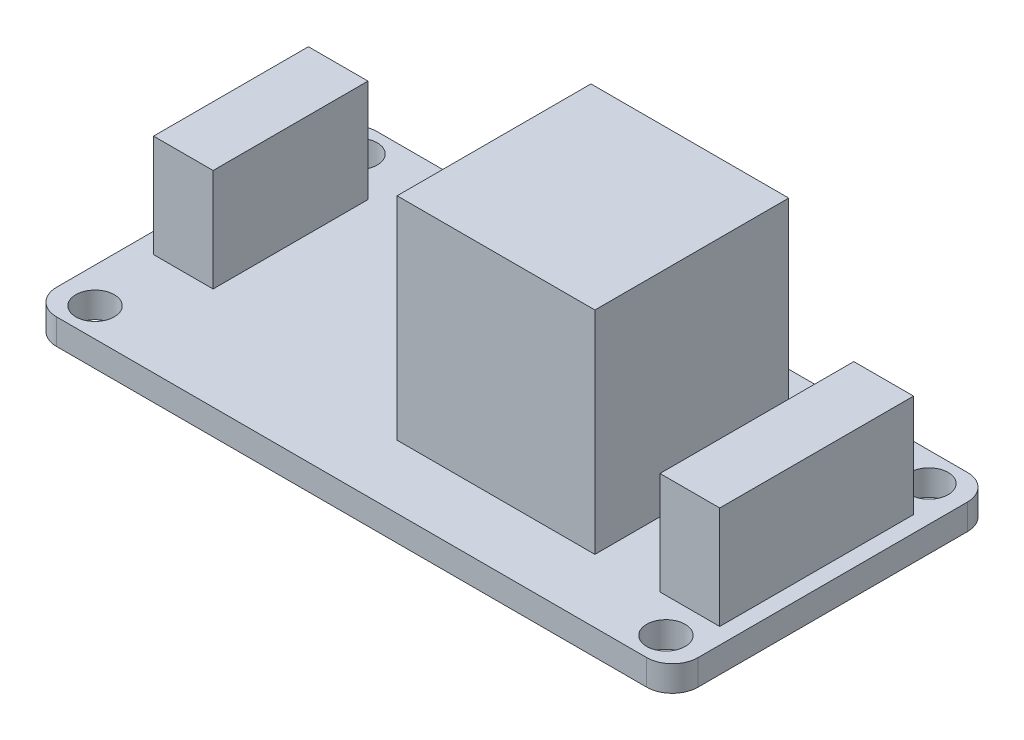
ISO-10303-21;
HEADER;
FILE_DESCRIPTION(('STEP AP214'),'2;1');
FILE_NAME('part.step','',(''),(''),'','','');
FILE_SCHEMA(('AUTOMOTIVE_DESIGN { 1 0 10303 214 1 1 1 1 }'));
ENDSEC;
DATA;
#1=APPLICATION_CONTEXT('core data for automotive mechanical design processes');
#2=APPLICATION_PROTOCOL_DEFINITION('international standard','automotive_design',2000,#1);
#3=PRODUCT_CONTEXT('',#1,'mechanical');
#4=PRODUCT('Part','Part','',(#3));
#5=PRODUCT_RELATED_PRODUCT_CATEGORY('part','',(#4));
#6=PRODUCT_DEFINITION_FORMATION('','',#4);
#7=PRODUCT_DEFINITION_CONTEXT('part definition',#1,'design');
#8=PRODUCT_DEFINITION('design','',#6,#7);
#9=PRODUCT_DEFINITION_SHAPE('','',#8);
#10=(LENGTH_UNIT() NAMED_UNIT(*) SI_UNIT(.MILLI.,.METRE.));
#11=(NAMED_UNIT(*) PLANE_ANGLE_UNIT() SI_UNIT($,.RADIAN.));
#12=(NAMED_UNIT(*) SI_UNIT($,.STERADIAN.) SOLID_ANGLE_UNIT());
#13=UNCERTAINTY_MEASURE_WITH_UNIT(LENGTH_MEASURE(1.E-05),#10,'distance_accuracy_value','');
#14=(GEOMETRIC_REPRESENTATION_CONTEXT(3) GLOBAL_UNCERTAINTY_ASSIGNED_CONTEXT((#13)) GLOBAL_UNIT_ASSIGNED_CONTEXT((#10,
#11,#12)) REPRESENTATION_CONTEXT('',''));
#15=CARTESIAN_POINT('',(0.,0.,0.));
#16=DIRECTION('',(0.,0.,1.));
#17=DIRECTION('',(1.,0.,0.));
#18=AXIS2_PLACEMENT_3D('',#15,#16,#17);
#19=CARTESIAN_POINT('',(0.,2.,0.));
#20=DIRECTION('',(0.,-1.,0.));
#21=DIRECTION('',(0.,0.,-1.));
#22=AXIS2_PLACEMENT_3D('',#19,#20,#21);
#23=PLANE('',#22);
#24=CARTESIAN_POINT('',(-22.25,2.,10.25));
#25=DIRECTION('',(0.,1.,0.));
#26=DIRECTION('',(0.,0.,-1.));
#27=AXIS2_PLACEMENT_3D('',#24,#25,#26);
#28=CIRCLE('',#27,1.5);
#29=CARTESIAN_POINT('',(-22.25,2.,8.75));
#30=VERTEX_POINT('',#29);
#31=EDGE_CURVE('E660',#30,#30,#28,.T.);
#32=ORIENTED_EDGE('',*,*,#31,.F.);
#33=EDGE_LOOP('',(#32));
#34=FACE_BOUND('',#33,.T.);
#35=CARTESIAN_POINT('',(22.25,2.,10.25));
#36=DIRECTION('',(0.,1.,0.));
#37=DIRECTION('',(0.,0.,1.));
#38=AXIS2_PLACEMENT_3D('',#35,#36,#37);
#39=CIRCLE('',#38,1.5);
#40=CARTESIAN_POINT('',(22.25,2.,11.75));
#41=VERTEX_POINT('',#40);
#42=EDGE_CURVE('E666',#41,#41,#39,.T.);
#43=ORIENTED_EDGE('',*,*,#42,.F.);
#44=EDGE_LOOP('',(#43));
#45=FACE_BOUND('',#44,.T.);
#46=CARTESIAN_POINT('',(22.25,2.,-10.25));
#47=DIRECTION('',(0.,1.,0.));
#48=DIRECTION('',(0.,0.,-1.));
#49=AXIS2_PLACEMENT_3D('',#46,#47,#48);
#50=CIRCLE('',#49,1.5);
#51=CARTESIAN_POINT('',(22.25,2.,-11.75));
#52=VERTEX_POINT('',#51);
#53=EDGE_CURVE('E672',#52,#52,#50,.T.);
#54=ORIENTED_EDGE('',*,*,#53,.F.);
#55=EDGE_LOOP('',(#54));
#56=FACE_BOUND('',#55,.T.);
#57=CARTESIAN_POINT('',(-22.25,2.,-10.25));
#58=DIRECTION('',(0.,1.,0.));
#59=DIRECTION('',(0.,0.,1.));
#60=AXIS2_PLACEMENT_3D('',#57,#58,#59);
#61=CIRCLE('',#60,1.5);
#62=CARTESIAN_POINT('',(-22.25,2.,-8.75));
#63=VERTEX_POINT('',#62);
#64=EDGE_CURVE('E652',#63,#63,#61,.T.);
#65=ORIENTED_EDGE('',*,*,#64,.F.);
#66=EDGE_LOOP('',(#65));
#67=FACE_BOUND('',#66,.T.);
#68=DIRECTION('',(1.,0.,0.));
#69=VECTOR('',#68,1.);
#70=CARTESIAN_POINT('',(0.,2.,4.51722782776187));
#71=LINE('',#70,#69);
#72=CARTESIAN_POINT('',(-23.4226143195784,2.,4.51722782776187));
#73=VERTEX_POINT('',#72);
#74=CARTESIAN_POINT('',(-18.7798477604559,2.,4.51722782776187));
#75=VERTEX_POINT('',#74);
#76=EDGE_CURVE('E199',#73,#75,#71,.T.);
#77=ORIENTED_EDGE('',*,*,#76,.F.);
#78=DIRECTION('',(0.,0.,-1.));
#79=VECTOR('',#78,1.);
#80=CARTESIAN_POINT('',(-23.4226143195784,2.,0.));
#81=LINE('',#80,#79);
#82=CARTESIAN_POINT('',(-23.4226143195784,2.,-7.55368079003915));
#83=VERTEX_POINT('',#82);
#84=EDGE_CURVE('E212',#73,#83,#81,.T.);
#85=ORIENTED_EDGE('',*,*,#84,.T.);
#86=DIRECTION('',(1.,0.,0.));
#87=VECTOR('',#86,1.);
#88=CARTESIAN_POINT('',(0.,2.,-7.55368079003915));
#89=LINE('',#88,#87);
#90=CARTESIAN_POINT('',(-18.7798477604559,2.,-7.55368079003915));
#91=VERTEX_POINT('',#90);
#92=EDGE_CURVE('E223',#83,#91,#89,.T.);
#93=ORIENTED_EDGE('',*,*,#92,.T.);
#94=DIRECTION('',(0.,0.,-1.));
#95=VECTOR('',#94,1.);
#96=CARTESIAN_POINT('',(-18.7798477604559,2.,0.));
#97=LINE('',#96,#95);
#98=EDGE_CURVE('E202',#75,#91,#97,.T.);
#99=ORIENTED_EDGE('',*,*,#98,.F.);
#100=EDGE_LOOP('',(#77,#85,#93,#99));
#101=FACE_BOUND('',#100,.T.);
#102=DIRECTION('',(0.,0.,-1.));
#103=VECTOR('',#102,1.);
#104=CARTESIAN_POINT('',(-1.40049791898988,2.,7.55368079003915));
#105=LINE('',#104,#103);
#106=CARTESIAN_POINT('',(-1.40049791898988,2.,7.55368079003915));
#107=VERTEX_POINT('',#106);
#108=CARTESIAN_POINT('',(-1.40049791898988,2.,-7.55368079003915));
#109=VERTEX_POINT('',#108);
#110=EDGE_CURVE('E241',#107,#109,#105,.T.);
#111=ORIENTED_EDGE('',*,*,#110,.T.);
#112=DIRECTION('',(1.,0.,0.));
#113=VECTOR('',#112,1.);
#114=CARTESIAN_POINT('',(-1.40049791898988,2.,-7.55368079003915));
#115=LINE('',#114,#113);
#116=CARTESIAN_POINT('',(14.0160765938653,2.,-7.55368079003915));
#117=VERTEX_POINT('',#116);
#118=EDGE_CURVE('E236',#109,#117,#115,.T.);
#119=ORIENTED_EDGE('',*,*,#118,.T.);
#120=DIRECTION('',(0.,0.,-1.));
#121=VECTOR('',#120,1.);
#122=CARTESIAN_POINT('',(14.0160765938653,2.,7.55368079003915));
#123=LINE('',#122,#121);
#124=CARTESIAN_POINT('',(14.0160765938653,2.,7.55368079003915));
#125=VERTEX_POINT('',#124);
#126=EDGE_CURVE('E251',#125,#117,#123,.T.);
#127=ORIENTED_EDGE('',*,*,#126,.F.);
#128=DIRECTION('',(1.,0.,0.));
#129=VECTOR('',#128,1.);
#130=CARTESIAN_POINT('',(-1.40049791898988,2.,7.55368079003915));
#131=LINE('',#130,#129);
#132=EDGE_CURVE('E254',#107,#125,#131,.T.);
#133=ORIENTED_EDGE('',*,*,#132,.F.);
#134=EDGE_LOOP('',(#111,#119,#127,#133));
#135=FACE_BOUND('',#134,.T.);
#136=DIRECTION('',(0.,0.,-1.));
#137=VECTOR('',#136,1.);
#138=CARTESIAN_POINT('',(25.,2.,12.5));
#139=LINE('',#138,#137);
#140=CARTESIAN_POINT('',(25.,2.,10.5));
#141=VERTEX_POINT('',#140);
#142=CARTESIAN_POINT('',(25.,2.,-10.5));
#143=VERTEX_POINT('',#142);
#144=EDGE_CURVE('E268',#141,#143,#139,.T.);
#145=ORIENTED_EDGE('',*,*,#144,.T.);
#146=CARTESIAN_POINT('',(23.,2.,-10.5));
#147=DIRECTION('',(0.,-1.,0.));
#148=DIRECTION('',(0.,0.,-1.));
#149=AXIS2_PLACEMENT_3D('',#146,#147,#148);
#150=CIRCLE('',#149,2.);
#151=CARTESIAN_POINT('',(23.,2.,-12.5));
#152=VERTEX_POINT('',#151);
#153=EDGE_CURVE('E311',#143,#152,#150,.F.);
#154=ORIENTED_EDGE('',*,*,#153,.T.);
#155=DIRECTION('',(-1.,0.,0.));
#156=VECTOR('',#155,1.);
#157=CARTESIAN_POINT('',(-25.,2.,-12.5));
#158=LINE('',#157,#156);
#159=CARTESIAN_POINT('',(-23.,2.,-12.5));
#160=VERTEX_POINT('',#159);
#161=EDGE_CURVE('E271',#152,#160,#158,.T.);
#162=ORIENTED_EDGE('',*,*,#161,.T.);
#163=CARTESIAN_POINT('',(-23.,2.,-10.5));
#164=DIRECTION('',(0.,-1.,0.));
#165=DIRECTION('',(0.,0.,-1.));
#166=AXIS2_PLACEMENT_3D('',#163,#164,#165);
#167=CIRCLE('',#166,2.);
#168=CARTESIAN_POINT('',(-25.,2.,-10.5));
#169=VERTEX_POINT('',#168);
#170=EDGE_CURVE('E306',#160,#169,#167,.F.);
#171=ORIENTED_EDGE('',*,*,#170,.T.);
#172=DIRECTION('',(0.,0.,1.));
#173=VECTOR('',#172,1.);
#174=CARTESIAN_POINT('',(-25.,2.,12.5));
#175=LINE('',#174,#173);
#176=CARTESIAN_POINT('',(-25.,2.,10.5));
#177=VERTEX_POINT('',#176);
#178=EDGE_CURVE('E275',#169,#177,#175,.T.);
#179=ORIENTED_EDGE('',*,*,#178,.T.);
#180=CARTESIAN_POINT('',(-23.,2.,10.5));
#181=DIRECTION('',(0.,-1.,0.));
#182=DIRECTION('',(0.,0.,-1.));
#183=AXIS2_PLACEMENT_3D('',#180,#181,#182);
#184=CIRCLE('',#183,2.);
#185=CARTESIAN_POINT('',(-23.,2.,12.5));
#186=VERTEX_POINT('',#185);
#187=EDGE_CURVE('E58',#177,#186,#184,.F.);
#188=ORIENTED_EDGE('',*,*,#187,.T.);
#189=DIRECTION('',(1.,0.,0.));
#190=VECTOR('',#189,1.);
#191=CARTESIAN_POINT('',(-25.,2.,12.5));
#192=LINE('',#191,#190);
#193=CARTESIAN_POINT('',(23.,2.,12.5));
#194=VERTEX_POINT('',#193);
#195=EDGE_CURVE('E277',#186,#194,#192,.T.);
#196=ORIENTED_EDGE('',*,*,#195,.T.);
#197=CARTESIAN_POINT('',(23.,2.,10.5));
#198=DIRECTION('',(0.,-1.,0.));
#199=DIRECTION('',(0.,0.,-1.));
#200=AXIS2_PLACEMENT_3D('',#197,#198,#199);
#201=CIRCLE('',#200,2.);
#202=EDGE_CURVE('E309',#194,#141,#201,.F.);
#203=ORIENTED_EDGE('',*,*,#202,.T.);
#204=EDGE_LOOP('',(#145,#154,#162,#171,#179,#188,#196,#203));
#205=FACE_BOUND('',#204,.T.);
#206=DIRECTION('',(1.,0.,0.));
#207=VECTOR('',#206,1.);
#208=CARTESIAN_POINT('',(0.,2.,7.55368079003915));
#209=LINE('',#208,#207);
#210=CARTESIAN_POINT('',(19.0897135690898,2.,7.55368079003915));
#211=VERTEX_POINT('',#210);
#212=CARTESIAN_POINT('',(23.7467902038446,2.,7.55368079003915));
#213=VERTEX_POINT('',#212);
#214=EDGE_CURVE('E197',#211,#213,#209,.T.);
#215=ORIENTED_EDGE('',*,*,#214,.F.);
#216=DIRECTION('',(0.,0.,-1.));
#217=VECTOR('',#216,1.);
#218=CARTESIAN_POINT('',(19.0897135690898,2.,0.));
#219=LINE('',#218,#217);
#220=CARTESIAN_POINT('',(19.0897135690898,2.,-7.55368079003915));
#221=VERTEX_POINT('',#220);
#222=EDGE_CURVE('E193',#211,#221,#219,.T.);
#223=ORIENTED_EDGE('',*,*,#222,.T.);
#224=DIRECTION('',(1.,0.,0.));
#225=VECTOR('',#224,1.);
#226=CARTESIAN_POINT('',(0.,2.,-7.55368079003915));
#227=LINE('',#226,#225);
#228=CARTESIAN_POINT('',(23.7467902038446,2.,-7.55368079003915));
#229=VERTEX_POINT('',#228);
#230=EDGE_CURVE('E637',#221,#229,#227,.T.);
#231=ORIENTED_EDGE('',*,*,#230,.T.);
#232=DIRECTION('',(0.,0.,-1.));
#233=VECTOR('',#232,1.);
#234=CARTESIAN_POINT('',(23.7467902038446,2.,0.));
#235=LINE('',#234,#233);
#236=EDGE_CURVE('E640',#213,#229,#235,.T.);
#237=ORIENTED_EDGE('',*,*,#236,.F.);
#238=EDGE_LOOP('',(#215,#223,#231,#237));
#239=FACE_BOUND('',#238,.T.);
#240=ADVANCED_FACE('F36',(#34,#45,#56,#67,#101,#135,#205,#239),#23,.F.);
#241=CARTESIAN_POINT('',(25.,2.,12.5));
#242=DIRECTION('',(-1.,0.,0.));
#243=DIRECTION('',(0.,0.,1.));
#244=AXIS2_PLACEMENT_3D('',#241,#242,#243);
#245=PLANE('',#244);
#246=DIRECTION('',(0.,0.,-1.));
#247=VECTOR('',#246,1.);
#248=CARTESIAN_POINT('',(25.,0.,12.5));
#249=LINE('',#248,#247);
#250=CARTESIAN_POINT('',(25.,0.,10.5));
#251=VERTEX_POINT('',#250);
#252=CARTESIAN_POINT('',(25.,0.,-10.5));
#253=VERTEX_POINT('',#252);
#254=EDGE_CURVE('E261',#251,#253,#249,.T.);
#255=ORIENTED_EDGE('',*,*,#254,.T.);
#256=DIRECTION('',(0.,-1.,0.));
#257=VECTOR('',#256,1.);
#258=CARTESIAN_POINT('',(25.,2.,-10.5));
#259=LINE('',#258,#257);
#260=EDGE_CURVE('E304',#253,#143,#259,.F.);
#261=ORIENTED_EDGE('',*,*,#260,.T.);
#262=ORIENTED_EDGE('',*,*,#144,.F.);
#263=DIRECTION('',(0.,-1.,0.));
#264=VECTOR('',#263,1.);
#265=CARTESIAN_POINT('',(25.,2.,10.5));
#266=LINE('',#265,#264);
#267=EDGE_CURVE('E301',#141,#251,#266,.T.);
#268=ORIENTED_EDGE('',*,*,#267,.T.);
#269=EDGE_LOOP('',(#255,#261,#262,#268));
#270=FACE_BOUND('',#269,.T.);
#271=ADVANCED_FACE('F341',(#270),#245,.F.);
#272=CARTESIAN_POINT('',(-25.,2.,-12.5));
#273=DIRECTION('',(0.,0.,1.));
#274=DIRECTION('',(1.,0.,0.));
#275=AXIS2_PLACEMENT_3D('',#272,#273,#274);
#276=PLANE('',#275);
#277=ORIENTED_EDGE('',*,*,#161,.F.);
#278=DIRECTION('',(0.,-1.,0.));
#279=VECTOR('',#278,1.);
#280=CARTESIAN_POINT('',(23.,2.,-12.5));
#281=LINE('',#280,#279);
#282=CARTESIAN_POINT('',(23.,0.,-12.5));
#283=VERTEX_POINT('',#282);
#284=EDGE_CURVE('E290',#152,#283,#281,.T.);
#285=ORIENTED_EDGE('',*,*,#284,.T.);
#286=DIRECTION('',(-1.,0.,0.));
#287=VECTOR('',#286,1.);
#288=CARTESIAN_POINT('',(-25.,0.,-12.5));
#289=LINE('',#288,#287);
#290=CARTESIAN_POINT('',(-23.,0.,-12.5));
#291=VERTEX_POINT('',#290);
#292=EDGE_CURVE('E282',#283,#291,#289,.T.);
#293=ORIENTED_EDGE('',*,*,#292,.T.);
#294=DIRECTION('',(0.,-1.,0.));
#295=VECTOR('',#294,1.);
#296=CARTESIAN_POINT('',(-23.,2.,-12.5));
#297=LINE('',#296,#295);
#298=EDGE_CURVE('E279',#291,#160,#297,.F.);
#299=ORIENTED_EDGE('',*,*,#298,.T.);
#300=EDGE_LOOP('',(#277,#285,#293,#299));
#301=FACE_BOUND('',#300,.T.);
#302=ADVANCED_FACE('F349',(#301),#276,.F.);
#303=CARTESIAN_POINT('',(-25.,2.,12.5));
#304=DIRECTION('',(1.,0.,0.));
#305=DIRECTION('',(0.,0.,-1.));
#306=AXIS2_PLACEMENT_3D('',#303,#304,#305);
#307=PLANE('',#306);
#308=DIRECTION('',(0.,0.,1.));
#309=VECTOR('',#308,1.);
#310=CARTESIAN_POINT('',(-25.,0.,12.5));
#311=LINE('',#310,#309);
#312=CARTESIAN_POINT('',(-25.,0.,-10.5));
#313=VERTEX_POINT('',#312);
#314=CARTESIAN_POINT('',(-25.,0.,10.5));
#315=VERTEX_POINT('',#314);
#316=EDGE_CURVE('E285',#313,#315,#311,.T.);
#317=ORIENTED_EDGE('',*,*,#316,.T.);
#318=DIRECTION('',(0.,-1.,0.));
#319=VECTOR('',#318,1.);
#320=CARTESIAN_POINT('',(-25.,2.,10.5));
#321=LINE('',#320,#319);
#322=EDGE_CURVE('E11',#315,#177,#321,.F.);
#323=ORIENTED_EDGE('',*,*,#322,.T.);
#324=ORIENTED_EDGE('',*,*,#178,.F.);
#325=DIRECTION('',(0.,-1.,0.));
#326=VECTOR('',#325,1.);
#327=CARTESIAN_POINT('',(-25.,2.,-10.5));
#328=LINE('',#327,#326);
#329=EDGE_CURVE('E44',#169,#313,#328,.T.);
#330=ORIENTED_EDGE('',*,*,#329,.T.);
#331=EDGE_LOOP('',(#317,#323,#324,#330));
#332=FACE_BOUND('',#331,.T.);
#333=ADVANCED_FACE('F321',(#332),#307,.F.);
#334=CARTESIAN_POINT('',(-25.,2.,12.5));
#335=DIRECTION('',(0.,0.,-1.));
#336=DIRECTION('',(-1.,0.,0.));
#337=AXIS2_PLACEMENT_3D('',#334,#335,#336);
#338=PLANE('',#337);
#339=DIRECTION('',(1.,0.,0.));
#340=VECTOR('',#339,1.);
#341=CARTESIAN_POINT('',(-25.,0.,12.5));
#342=LINE('',#341,#340);
#343=CARTESIAN_POINT('',(-23.,0.,12.5));
#344=VERTEX_POINT('',#343);
#345=CARTESIAN_POINT('',(23.,0.,12.5));
#346=VERTEX_POINT('',#345);
#347=EDGE_CURVE('E272',#344,#346,#342,.T.);
#348=ORIENTED_EDGE('',*,*,#347,.T.);
#349=DIRECTION('',(0.,-1.,0.));
#350=VECTOR('',#349,1.);
#351=CARTESIAN_POINT('',(23.,2.,12.5));
#352=LINE('',#351,#350);
#353=EDGE_CURVE('E51',#346,#194,#352,.F.);
#354=ORIENTED_EDGE('',*,*,#353,.T.);
#355=ORIENTED_EDGE('',*,*,#195,.F.);
#356=DIRECTION('',(0.,-1.,0.));
#357=VECTOR('',#356,1.);
#358=CARTESIAN_POINT('',(-23.,2.,12.5));
#359=LINE('',#358,#357);
#360=EDGE_CURVE('E313',#186,#344,#359,.T.);
#361=ORIENTED_EDGE('',*,*,#360,.T.);
#362=EDGE_LOOP('',(#348,#354,#355,#361));
#363=FACE_BOUND('',#362,.T.);
#364=ADVANCED_FACE('F332',(#363),#338,.F.);
#365=CARTESIAN_POINT('',(0.,0.,0.));
#366=DIRECTION('',(0.,-1.,0.));
#367=DIRECTION('',(0.,0.,-1.));
#368=AXIS2_PLACEMENT_3D('',#365,#366,#367);
#369=PLANE('',#368);
#370=CARTESIAN_POINT('',(-22.25,0.,10.25));
#371=DIRECTION('',(0.,1.,0.));
#372=DIRECTION('',(0.,0.,-1.));
#373=AXIS2_PLACEMENT_3D('',#370,#371,#372);
#374=CIRCLE('',#373,1.5);
#375=CARTESIAN_POINT('',(-22.25,0.,8.75));
#376=VERTEX_POINT('',#375);
#377=EDGE_CURVE('E663',#376,#376,#374,.T.);
#378=ORIENTED_EDGE('',*,*,#377,.T.);
#379=EDGE_LOOP('',(#378));
#380=FACE_BOUND('',#379,.T.);
#381=CARTESIAN_POINT('',(22.25,0.,10.25));
#382=DIRECTION('',(0.,1.,0.));
#383=DIRECTION('',(0.,0.,1.));
#384=AXIS2_PLACEMENT_3D('',#381,#382,#383);
#385=CIRCLE('',#384,1.5);
#386=CARTESIAN_POINT('',(22.25,0.,11.75));
#387=VERTEX_POINT('',#386);
#388=EDGE_CURVE('E669',#387,#387,#385,.T.);
#389=ORIENTED_EDGE('',*,*,#388,.T.);
#390=EDGE_LOOP('',(#389));
#391=FACE_BOUND('',#390,.T.);
#392=CARTESIAN_POINT('',(22.25,0.,-10.25));
#393=DIRECTION('',(0.,1.,0.));
#394=DIRECTION('',(0.,0.,-1.));
#395=AXIS2_PLACEMENT_3D('',#392,#393,#394);
#396=CIRCLE('',#395,1.5);
#397=CARTESIAN_POINT('',(22.25,0.,-11.75));
#398=VERTEX_POINT('',#397);
#399=EDGE_CURVE('E657',#398,#398,#396,.T.);
#400=ORIENTED_EDGE('',*,*,#399,.T.);
#401=EDGE_LOOP('',(#400));
#402=FACE_BOUND('',#401,.T.);
#403=CARTESIAN_POINT('',(-22.25,0.,-10.25));
#404=DIRECTION('',(0.,1.,0.));
#405=DIRECTION('',(0.,0.,1.));
#406=AXIS2_PLACEMENT_3D('',#403,#404,#405);
#407=CIRCLE('',#406,1.5);
#408=CARTESIAN_POINT('',(-22.25,0.,-8.75));
#409=VERTEX_POINT('',#408);
#410=EDGE_CURVE('E650',#409,#409,#407,.T.);
#411=ORIENTED_EDGE('',*,*,#410,.T.);
#412=EDGE_LOOP('',(#411));
#413=FACE_BOUND('',#412,.T.);
#414=ORIENTED_EDGE('',*,*,#292,.F.);
#415=CARTESIAN_POINT('',(23.,0.,-10.5));
#416=DIRECTION('',(0.,-1.,0.));
#417=DIRECTION('',(0.,0.,-1.));
#418=AXIS2_PLACEMENT_3D('',#415,#416,#417);
#419=CIRCLE('',#418,2.);
#420=EDGE_CURVE('E299',#283,#253,#419,.T.);
#421=ORIENTED_EDGE('',*,*,#420,.T.);
#422=ORIENTED_EDGE('',*,*,#254,.F.);
#423=CARTESIAN_POINT('',(23.,0.,10.5));
#424=DIRECTION('',(0.,-1.,0.));
#425=DIRECTION('',(0.,0.,-1.));
#426=AXIS2_PLACEMENT_3D('',#423,#424,#425);
#427=CIRCLE('',#426,2.);
#428=EDGE_CURVE('E297',#251,#346,#427,.T.);
#429=ORIENTED_EDGE('',*,*,#428,.T.);
#430=ORIENTED_EDGE('',*,*,#347,.F.);
#431=CARTESIAN_POINT('',(-23.,0.,10.5));
#432=DIRECTION('',(0.,-1.,0.));
#433=DIRECTION('',(0.,0.,-1.));
#434=AXIS2_PLACEMENT_3D('',#431,#432,#433);
#435=CIRCLE('',#434,2.);
#436=EDGE_CURVE('E295',#344,#315,#435,.T.);
#437=ORIENTED_EDGE('',*,*,#436,.T.);
#438=ORIENTED_EDGE('',*,*,#316,.F.);
#439=CARTESIAN_POINT('',(-23.,0.,-10.5));
#440=DIRECTION('',(0.,-1.,0.));
#441=DIRECTION('',(0.,0.,-1.));
#442=AXIS2_PLACEMENT_3D('',#439,#440,#441);
#443=CIRCLE('',#442,2.);
#444=EDGE_CURVE('E293',#313,#291,#443,.T.);
#445=ORIENTED_EDGE('',*,*,#444,.T.);
#446=EDGE_LOOP('',(#414,#421,#422,#429,#430,#437,#438,#445));
#447=FACE_BOUND('',#446,.T.);
#448=ADVANCED_FACE('F327',(#380,#391,#402,#413,#447),#369,.T.);
#449=CARTESIAN_POINT('',(-1.40049791898988,18.5,-7.55368079003915));
#450=DIRECTION('',(0.,0.,-1.));
#451=DIRECTION('',(-1.,0.,0.));
#452=AXIS2_PLACEMENT_3D('',#449,#450,#451);
#453=PLANE('',#452);
#454=ORIENTED_EDGE('',*,*,#118,.F.);
#455=DIRECTION('',(0.,-1.,0.));
#456=VECTOR('',#455,1.);
#457=CARTESIAN_POINT('',(-1.40049791898988,18.5,-7.55368079003915));
#458=LINE('',#457,#456);
#459=CARTESIAN_POINT('',(-1.40049791898988,18.5,-7.55368079003915));
#460=VERTEX_POINT('',#459);
#461=EDGE_CURVE('E258',#460,#109,#458,.T.);
#462=ORIENTED_EDGE('',*,*,#461,.F.);
#463=DIRECTION('',(1.,0.,0.));
#464=VECTOR('',#463,1.);
#465=CARTESIAN_POINT('',(-1.40049791898988,18.5,-7.55368079003915));
#466=LINE('',#465,#464);
#467=CARTESIAN_POINT('',(14.0160765938653,18.5,-7.55368079003915));
#468=VERTEX_POINT('',#467);
#469=EDGE_CURVE('E237',#460,#468,#466,.T.);
#470=ORIENTED_EDGE('',*,*,#469,.T.);
#471=DIRECTION('',(0.,-1.,0.));
#472=VECTOR('',#471,1.);
#473=CARTESIAN_POINT('',(14.0160765938653,18.5,-7.55368079003915));
#474=LINE('',#473,#472);
#475=EDGE_CURVE('E248',#468,#117,#474,.T.);
#476=ORIENTED_EDGE('',*,*,#475,.T.);
#477=EDGE_LOOP('',(#454,#462,#470,#476));
#478=FACE_BOUND('',#477,.T.);
#479=ADVANCED_FACE('F367',(#478),#453,.T.);
#480=CARTESIAN_POINT('',(-1.40049791898988,18.5,7.55368079003915));
#481=DIRECTION('',(-1.,0.,0.));
#482=DIRECTION('',(0.,0.,1.));
#483=AXIS2_PLACEMENT_3D('',#480,#481,#482);
#484=PLANE('',#483);
#485=ORIENTED_EDGE('',*,*,#110,.F.);
#486=DIRECTION('',(0.,-1.,0.));
#487=VECTOR('',#486,1.);
#488=CARTESIAN_POINT('',(-1.40049791898988,18.5,7.55368079003915));
#489=LINE('',#488,#487);
#490=CARTESIAN_POINT('',(-1.40049791898988,18.5,7.55368079003915));
#491=VERTEX_POINT('',#490);
#492=EDGE_CURVE('E262',#491,#107,#489,.T.);
#493=ORIENTED_EDGE('',*,*,#492,.F.);
#494=DIRECTION('',(0.,0.,-1.));
#495=VECTOR('',#494,1.);
#496=CARTESIAN_POINT('',(-1.40049791898988,18.5,7.55368079003915));
#497=LINE('',#496,#495);
#498=EDGE_CURVE('E245',#491,#460,#497,.T.);
#499=ORIENTED_EDGE('',*,*,#498,.T.);
#500=ORIENTED_EDGE('',*,*,#461,.T.);
#501=EDGE_LOOP('',(#485,#493,#499,#500));
#502=FACE_BOUND('',#501,.T.);
#503=ADVANCED_FACE('F551',(#502),#484,.T.);
#504=CARTESIAN_POINT('',(-1.40049791898988,18.5,7.55368079003915));
#505=DIRECTION('',(0.,0.,-1.));
#506=DIRECTION('',(-1.,0.,0.));
#507=AXIS2_PLACEMENT_3D('',#504,#505,#506);
#508=PLANE('',#507);
#509=ORIENTED_EDGE('',*,*,#132,.T.);
#510=DIRECTION('',(0.,-1.,0.));
#511=VECTOR('',#510,1.);
#512=CARTESIAN_POINT('',(14.0160765938653,18.5,7.55368079003915));
#513=LINE('',#512,#511);
#514=CARTESIAN_POINT('',(14.0160765938653,18.5,7.55368079003915));
#515=VERTEX_POINT('',#514);
#516=EDGE_CURVE('E264',#515,#125,#513,.T.);
#517=ORIENTED_EDGE('',*,*,#516,.F.);
#518=DIRECTION('',(1.,0.,0.));
#519=VECTOR('',#518,1.);
#520=CARTESIAN_POINT('',(-1.40049791898988,18.5,7.55368079003915));
#521=LINE('',#520,#519);
#522=EDGE_CURVE('E243',#491,#515,#521,.T.);
#523=ORIENTED_EDGE('',*,*,#522,.F.);
#524=ORIENTED_EDGE('',*,*,#492,.T.);
#525=EDGE_LOOP('',(#509,#517,#523,#524));
#526=FACE_BOUND('',#525,.T.);
#527=ADVANCED_FACE('F543',(#526),#508,.F.);
#528=CARTESIAN_POINT('',(14.0160765938653,18.5,7.55368079003915));
#529=DIRECTION('',(-1.,0.,0.));
#530=DIRECTION('',(0.,0.,1.));
#531=AXIS2_PLACEMENT_3D('',#528,#529,#530);
#532=PLANE('',#531);
#533=ORIENTED_EDGE('',*,*,#126,.T.);
#534=ORIENTED_EDGE('',*,*,#475,.F.);
#535=DIRECTION('',(0.,0.,-1.));
#536=VECTOR('',#535,1.);
#537=CARTESIAN_POINT('',(14.0160765938653,18.5,7.55368079003915));
#538=LINE('',#537,#536);
#539=EDGE_CURVE('E240',#515,#468,#538,.T.);
#540=ORIENTED_EDGE('',*,*,#539,.F.);
#541=ORIENTED_EDGE('',*,*,#516,.T.);
#542=EDGE_LOOP('',(#533,#534,#540,#541));
#543=FACE_BOUND('',#542,.T.);
#544=ADVANCED_FACE('F534',(#543),#532,.F.);
#545=CARTESIAN_POINT('',(0.,18.5,0.));
#546=DIRECTION('',(0.,1.,0.));
#547=DIRECTION('',(0.,0.,1.));
#548=AXIS2_PLACEMENT_3D('',#545,#546,#547);
#549=PLANE('',#548);
#550=ORIENTED_EDGE('',*,*,#469,.F.);
#551=ORIENTED_EDGE('',*,*,#498,.F.);
#552=ORIENTED_EDGE('',*,*,#522,.T.);
#553=ORIENTED_EDGE('',*,*,#539,.T.);
#554=EDGE_LOOP('',(#550,#551,#552,#553));
#555=FACE_BOUND('',#554,.T.);
#556=ADVANCED_FACE('F520',(#555),#549,.T.);
#557=CARTESIAN_POINT('',(0.,10.,4.51722782776187));
#558=DIRECTION('',(0.,0.,-1.));
#559=DIRECTION('',(-1.,0.,0.));
#560=AXIS2_PLACEMENT_3D('',#557,#558,#559);
#561=PLANE('',#560);
#562=ORIENTED_EDGE('',*,*,#76,.T.);
#563=DIRECTION('',(0.,-1.,0.));
#564=VECTOR('',#563,1.);
#565=CARTESIAN_POINT('',(-18.7798477604559,10.,4.51722782776187));
#566=LINE('',#565,#564);
#567=CARTESIAN_POINT('',(-18.7798477604559,10.,4.51722782776187));
#568=VERTEX_POINT('',#567);
#569=EDGE_CURVE('E234',#568,#75,#566,.T.);
#570=ORIENTED_EDGE('',*,*,#569,.F.);
#571=DIRECTION('',(1.,0.,0.));
#572=VECTOR('',#571,1.);
#573=CARTESIAN_POINT('',(0.,10.,4.51722782776187));
#574=LINE('',#573,#572);
#575=CARTESIAN_POINT('',(-23.4226143195784,10.,4.51722782776187));
#576=VERTEX_POINT('',#575);
#577=EDGE_CURVE('E208',#576,#568,#574,.T.);
#578=ORIENTED_EDGE('',*,*,#577,.F.);
#579=DIRECTION('',(0.,-1.,0.));
#580=VECTOR('',#579,1.);
#581=CARTESIAN_POINT('',(-23.4226143195784,10.,4.51722782776187));
#582=LINE('',#581,#580);
#583=EDGE_CURVE('E219',#576,#73,#582,.T.);
#584=ORIENTED_EDGE('',*,*,#583,.T.);
#585=EDGE_LOOP('',(#562,#570,#578,#584));
#586=FACE_BOUND('',#585,.T.);
#587=ADVANCED_FACE('F511',(#586),#561,.F.);
#588=CARTESIAN_POINT('',(-18.7798477604559,10.,0.));
#589=DIRECTION('',(-1.,0.,0.));
#590=DIRECTION('',(0.,0.,1.));
#591=AXIS2_PLACEMENT_3D('',#588,#589,#590);
#592=PLANE('',#591);
#593=ORIENTED_EDGE('',*,*,#98,.T.);
#594=DIRECTION('',(0.,-1.,0.));
#595=VECTOR('',#594,1.);
#596=CARTESIAN_POINT('',(-18.7798477604559,10.,-7.55368079003915));
#597=LINE('',#596,#595);
#598=CARTESIAN_POINT('',(-18.7798477604559,10.,-7.55368079003915));
#599=VERTEX_POINT('',#598);
#600=EDGE_CURVE('E232',#599,#91,#597,.T.);
#601=ORIENTED_EDGE('',*,*,#600,.F.);
#602=DIRECTION('',(0.,0.,-1.));
#603=VECTOR('',#602,1.);
#604=CARTESIAN_POINT('',(-18.7798477604559,10.,0.));
#605=LINE('',#604,#603);
#606=EDGE_CURVE('E211',#568,#599,#605,.T.);
#607=ORIENTED_EDGE('',*,*,#606,.F.);
#608=ORIENTED_EDGE('',*,*,#569,.T.);
#609=EDGE_LOOP('',(#593,#601,#607,#608));
#610=FACE_BOUND('',#609,.T.);
#611=ADVANCED_FACE('F502',(#610),#592,.F.);
#612=CARTESIAN_POINT('',(0.,10.,-7.55368079003915));
#613=DIRECTION('',(0.,0.,-1.));
#614=DIRECTION('',(-1.,0.,0.));
#615=AXIS2_PLACEMENT_3D('',#612,#613,#614);
#616=PLANE('',#615);
#617=ORIENTED_EDGE('',*,*,#92,.F.);
#618=DIRECTION('',(0.,-1.,0.));
#619=VECTOR('',#618,1.);
#620=CARTESIAN_POINT('',(-23.4226143195784,10.,-7.55368079003915));
#621=LINE('',#620,#619);
#622=CARTESIAN_POINT('',(-23.4226143195784,10.,-7.55368079003915));
#623=VERTEX_POINT('',#622);
#624=EDGE_CURVE('E229',#623,#83,#621,.T.);
#625=ORIENTED_EDGE('',*,*,#624,.F.);
#626=DIRECTION('',(1.,0.,0.));
#627=VECTOR('',#626,1.);
#628=CARTESIAN_POINT('',(0.,10.,-7.55368079003915));
#629=LINE('',#628,#627);
#630=EDGE_CURVE('E214',#623,#599,#629,.T.);
#631=ORIENTED_EDGE('',*,*,#630,.T.);
#632=ORIENTED_EDGE('',*,*,#600,.T.);
#633=EDGE_LOOP('',(#617,#625,#631,#632));
#634=FACE_BOUND('',#633,.T.);
#635=ADVANCED_FACE('F493',(#634),#616,.T.);
#636=CARTESIAN_POINT('',(-23.4226143195784,10.,0.));
#637=DIRECTION('',(-1.,0.,0.));
#638=DIRECTION('',(0.,0.,1.));
#639=AXIS2_PLACEMENT_3D('',#636,#637,#638);
#640=PLANE('',#639);
#641=ORIENTED_EDGE('',*,*,#84,.F.);
#642=ORIENTED_EDGE('',*,*,#583,.F.);
#643=DIRECTION('',(0.,0.,-1.));
#644=VECTOR('',#643,1.);
#645=CARTESIAN_POINT('',(-23.4226143195784,10.,0.));
#646=LINE('',#645,#644);
#647=EDGE_CURVE('E217',#576,#623,#646,.T.);
#648=ORIENTED_EDGE('',*,*,#647,.T.);
#649=ORIENTED_EDGE('',*,*,#624,.T.);
#650=EDGE_LOOP('',(#641,#642,#648,#649));
#651=FACE_BOUND('',#650,.T.);
#652=ADVANCED_FACE('F484',(#651),#640,.T.);
#653=CARTESIAN_POINT('',(0.,10.,0.));
#654=DIRECTION('',(0.,1.,0.));
#655=DIRECTION('',(0.,0.,1.));
#656=AXIS2_PLACEMENT_3D('',#653,#654,#655);
#657=PLANE('',#656);
#658=ORIENTED_EDGE('',*,*,#577,.T.);
#659=ORIENTED_EDGE('',*,*,#606,.T.);
#660=ORIENTED_EDGE('',*,*,#630,.F.);
#661=ORIENTED_EDGE('',*,*,#647,.F.);
#662=EDGE_LOOP('',(#658,#659,#660,#661));
#663=FACE_BOUND('',#662,.T.);
#664=ADVANCED_FACE('F476',(#663),#657,.T.);
#665=CARTESIAN_POINT('',(0.,10.,7.55368079003915));
#666=DIRECTION('',(0.,0.,-1.));
#667=DIRECTION('',(-1.,0.,0.));
#668=AXIS2_PLACEMENT_3D('',#665,#666,#667);
#669=PLANE('',#668);
#670=ORIENTED_EDGE('',*,*,#214,.T.);
#671=DIRECTION('',(0.,-1.,0.));
#672=VECTOR('',#671,1.);
#673=CARTESIAN_POINT('',(23.7467902038446,10.,7.55368079003915));
#674=LINE('',#673,#672);
#675=CARTESIAN_POINT('',(23.7467902038446,10.,7.55368079003915));
#676=VERTEX_POINT('',#675);
#677=EDGE_CURVE('E178',#676,#213,#674,.T.);
#678=ORIENTED_EDGE('',*,*,#677,.F.);
#679=DIRECTION('',(1.,0.,0.));
#680=VECTOR('',#679,1.);
#681=CARTESIAN_POINT('',(0.,10.,7.55368079003915));
#682=LINE('',#681,#680);
#683=CARTESIAN_POINT('',(19.0897135690898,10.,7.55368079003915));
#684=VERTEX_POINT('',#683);
#685=EDGE_CURVE('E185',#684,#676,#682,.T.);
#686=ORIENTED_EDGE('',*,*,#685,.F.);
#687=DIRECTION('',(0.,-1.,0.));
#688=VECTOR('',#687,1.);
#689=CARTESIAN_POINT('',(19.0897135690898,10.,7.55368079003915));
#690=LINE('',#689,#688);
#691=EDGE_CURVE('E643',#684,#211,#690,.T.);
#692=ORIENTED_EDGE('',*,*,#691,.T.);
#693=EDGE_LOOP('',(#670,#678,#686,#692));
#694=FACE_BOUND('',#693,.T.);
#695=ADVANCED_FACE('F195',(#694),#669,.F.);
#696=CARTESIAN_POINT('',(23.7467902038446,10.,0.));
#697=DIRECTION('',(-1.,0.,0.));
#698=DIRECTION('',(0.,0.,1.));
#699=AXIS2_PLACEMENT_3D('',#696,#697,#698);
#700=PLANE('',#699);
#701=ORIENTED_EDGE('',*,*,#236,.T.);
#702=DIRECTION('',(0.,-1.,0.));
#703=VECTOR('',#702,1.);
#704=CARTESIAN_POINT('',(23.7467902038446,10.,-7.55368079003915));
#705=LINE('',#704,#703);
#706=CARTESIAN_POINT('',(23.7467902038446,10.,-7.55368079003915));
#707=VERTEX_POINT('',#706);
#708=EDGE_CURVE('E180',#707,#229,#705,.T.);
#709=ORIENTED_EDGE('',*,*,#708,.F.);
#710=DIRECTION('',(0.,0.,-1.));
#711=VECTOR('',#710,1.);
#712=CARTESIAN_POINT('',(23.7467902038446,10.,0.));
#713=LINE('',#712,#711);
#714=EDGE_CURVE('E173',#676,#707,#713,.T.);
#715=ORIENTED_EDGE('',*,*,#714,.F.);
#716=ORIENTED_EDGE('',*,*,#677,.T.);
#717=EDGE_LOOP('',(#701,#709,#715,#716));
#718=FACE_BOUND('',#717,.T.);
#719=ADVANCED_FACE('F176',(#718),#700,.F.);
#720=CARTESIAN_POINT('',(0.,10.,-7.55368079003915));
#721=DIRECTION('',(0.,0.,-1.));
#722=DIRECTION('',(-1.,0.,0.));
#723=AXIS2_PLACEMENT_3D('',#720,#721,#722);
#724=PLANE('',#723);
#725=ORIENTED_EDGE('',*,*,#230,.F.);
#726=DIRECTION('',(0.,-1.,0.));
#727=VECTOR('',#726,1.);
#728=CARTESIAN_POINT('',(19.0897135690898,10.,-7.55368079003915));
#729=LINE('',#728,#727);
#730=CARTESIAN_POINT('',(19.0897135690898,10.,-7.55368079003915));
#731=VERTEX_POINT('',#730);
#732=EDGE_CURVE('E204',#731,#221,#729,.T.);
#733=ORIENTED_EDGE('',*,*,#732,.F.);
#734=DIRECTION('',(1.,0.,0.));
#735=VECTOR('',#734,1.);
#736=CARTESIAN_POINT('',(0.,10.,-7.55368079003915));
#737=LINE('',#736,#735);
#738=EDGE_CURVE('E184',#731,#707,#737,.T.);
#739=ORIENTED_EDGE('',*,*,#738,.T.);
#740=ORIENTED_EDGE('',*,*,#708,.T.);
#741=EDGE_LOOP('',(#725,#733,#739,#740));
#742=FACE_BOUND('',#741,.T.);
#743=ADVANCED_FACE('F452',(#742),#724,.T.);
#744=CARTESIAN_POINT('',(19.0897135690898,10.,0.));
#745=DIRECTION('',(-1.,0.,0.));
#746=DIRECTION('',(0.,0.,1.));
#747=AXIS2_PLACEMENT_3D('',#744,#745,#746);
#748=PLANE('',#747);
#749=ORIENTED_EDGE('',*,*,#222,.F.);
#750=ORIENTED_EDGE('',*,*,#691,.F.);
#751=DIRECTION('',(0.,0.,-1.));
#752=VECTOR('',#751,1.);
#753=CARTESIAN_POINT('',(19.0897135690898,10.,0.));
#754=LINE('',#753,#752);
#755=EDGE_CURVE('E191',#684,#731,#754,.T.);
#756=ORIENTED_EDGE('',*,*,#755,.T.);
#757=ORIENTED_EDGE('',*,*,#732,.T.);
#758=EDGE_LOOP('',(#749,#750,#756,#757));
#759=FACE_BOUND('',#758,.T.);
#760=ADVANCED_FACE('F444',(#759),#748,.T.);
#761=CARTESIAN_POINT('',(0.,10.,0.));
#762=DIRECTION('',(0.,1.,0.));
#763=DIRECTION('',(0.,0.,1.));
#764=AXIS2_PLACEMENT_3D('',#761,#762,#763);
#765=PLANE('',#764);
#766=ORIENTED_EDGE('',*,*,#685,.T.);
#767=ORIENTED_EDGE('',*,*,#714,.T.);
#768=ORIENTED_EDGE('',*,*,#738,.F.);
#769=ORIENTED_EDGE('',*,*,#755,.F.);
#770=EDGE_LOOP('',(#766,#767,#768,#769));
#771=FACE_BOUND('',#770,.T.);
#772=ADVANCED_FACE('F189',(#771),#765,.T.);
#773=CARTESIAN_POINT('',(-22.25,0.,-10.25));
#774=DIRECTION('',(0.,1.,0.));
#775=DIRECTION('',(0.,0.,1.));
#776=AXIS2_PLACEMENT_3D('',#773,#774,#775);
#777=CYLINDRICAL_SURFACE('',#776,1.5);
#778=ORIENTED_EDGE('',*,*,#410,.F.);
#779=EDGE_LOOP('',(#778));
#780=FACE_BOUND('',#779,.T.);
#781=ORIENTED_EDGE('',*,*,#64,.T.);
#782=EDGE_LOOP('',(#781));
#783=FACE_BOUND('',#782,.T.);
#784=ADVANCED_FACE('F427',(#780,#783),#777,.F.);
#785=CARTESIAN_POINT('',(22.25,0.,-10.25));
#786=DIRECTION('',(0.,1.,0.));
#787=DIRECTION('',(0.,0.,1.));
#788=AXIS2_PLACEMENT_3D('',#785,#786,#787);
#789=CYLINDRICAL_SURFACE('',#788,1.5);
#790=ORIENTED_EDGE('',*,*,#399,.F.);
#791=EDGE_LOOP('',(#790));
#792=FACE_BOUND('',#791,.T.);
#793=ORIENTED_EDGE('',*,*,#53,.T.);
#794=EDGE_LOOP('',(#793));
#795=FACE_BOUND('',#794,.T.);
#796=ADVANCED_FACE('F418',(#792,#795),#789,.F.);
#797=CARTESIAN_POINT('',(22.25,0.,10.25));
#798=DIRECTION('',(0.,1.,0.));
#799=DIRECTION('',(0.,0.,1.));
#800=AXIS2_PLACEMENT_3D('',#797,#798,#799);
#801=CYLINDRICAL_SURFACE('',#800,1.5);
#802=ORIENTED_EDGE('',*,*,#388,.F.);
#803=EDGE_LOOP('',(#802));
#804=FACE_BOUND('',#803,.T.);
#805=ORIENTED_EDGE('',*,*,#42,.T.);
#806=EDGE_LOOP('',(#805));
#807=FACE_BOUND('',#806,.T.);
#808=ADVANCED_FACE('F409',(#804,#807),#801,.F.);
#809=CARTESIAN_POINT('',(-22.25,0.,10.25));
#810=DIRECTION('',(0.,1.,0.));
#811=DIRECTION('',(0.,0.,1.));
#812=AXIS2_PLACEMENT_3D('',#809,#810,#811);
#813=CYLINDRICAL_SURFACE('',#812,1.5);
#814=ORIENTED_EDGE('',*,*,#377,.F.);
#815=EDGE_LOOP('',(#814));
#816=FACE_BOUND('',#815,.T.);
#817=ORIENTED_EDGE('',*,*,#31,.T.);
#818=EDGE_LOOP('',(#817));
#819=FACE_BOUND('',#818,.T.);
#820=ADVANCED_FACE('F380',(#816,#819),#813,.F.);
#821=CARTESIAN_POINT('',(23.,2.,-10.5));
#822=DIRECTION('',(0.,-1.,0.));
#823=DIRECTION('',(0.,0.,-1.));
#824=AXIS2_PLACEMENT_3D('',#821,#822,#823);
#825=CYLINDRICAL_SURFACE('',#824,2.);
#826=ORIENTED_EDGE('',*,*,#153,.F.);
#827=ORIENTED_EDGE('',*,*,#260,.F.);
#828=ORIENTED_EDGE('',*,*,#420,.F.);
#829=ORIENTED_EDGE('',*,*,#284,.F.);
#830=EDGE_LOOP('',(#826,#827,#828,#829));
#831=FACE_BOUND('',#830,.T.);
#832=ADVANCED_FACE('F346',(#831),#825,.T.);
#833=CARTESIAN_POINT('',(23.,2.,10.5));
#834=DIRECTION('',(0.,-1.,0.));
#835=DIRECTION('',(0.,0.,-1.));
#836=AXIS2_PLACEMENT_3D('',#833,#834,#835);
#837=CYLINDRICAL_SURFACE('',#836,2.);
#838=ORIENTED_EDGE('',*,*,#202,.F.);
#839=ORIENTED_EDGE('',*,*,#353,.F.);
#840=ORIENTED_EDGE('',*,*,#428,.F.);
#841=ORIENTED_EDGE('',*,*,#267,.F.);
#842=EDGE_LOOP('',(#838,#839,#840,#841));
#843=FACE_BOUND('',#842,.T.);
#844=ADVANCED_FACE('F338',(#843),#837,.T.);
#845=CARTESIAN_POINT('',(-23.,2.,10.5));
#846=DIRECTION('',(0.,-1.,0.));
#847=DIRECTION('',(0.,0.,-1.));
#848=AXIS2_PLACEMENT_3D('',#845,#846,#847);
#849=CYLINDRICAL_SURFACE('',#848,2.);
#850=ORIENTED_EDGE('',*,*,#187,.F.);
#851=ORIENTED_EDGE('',*,*,#322,.F.);
#852=ORIENTED_EDGE('',*,*,#436,.F.);
#853=ORIENTED_EDGE('',*,*,#360,.F.);
#854=EDGE_LOOP('',(#850,#851,#852,#853));
#855=FACE_BOUND('',#854,.T.);
#856=ADVANCED_FACE('F331',(#855),#849,.T.);
#857=CARTESIAN_POINT('',(-23.,2.,-10.5));
#858=DIRECTION('',(0.,-1.,0.));
#859=DIRECTION('',(0.,0.,-1.));
#860=AXIS2_PLACEMENT_3D('',#857,#858,#859);
#861=CYLINDRICAL_SURFACE('',#860,2.);
#862=ORIENTED_EDGE('',*,*,#170,.F.);
#863=ORIENTED_EDGE('',*,*,#298,.F.);
#864=ORIENTED_EDGE('',*,*,#444,.F.);
#865=ORIENTED_EDGE('',*,*,#329,.F.);
#866=EDGE_LOOP('',(#862,#863,#864,#865));
#867=FACE_BOUND('',#866,.T.);
#868=ADVANCED_FACE('F38',(#867),#861,.T.);
#869=CLOSED_SHELL('',(#240,#271,#302,#333,#364,#448,#479,#503,#527,#544,#556,#587,#611,#635,
#652,#664,#695,#719,#743,#760,#772,#784,#796,#808,#820,#832,#844,#856,#868));
#870=MANIFOLD_SOLID_BREP('B2',#869);
#871=ADVANCED_BREP_SHAPE_REPRESENTATION('',(#18,#870),#14);
#872=SHAPE_DEFINITION_REPRESENTATION(#9,#871);
ENDSEC;
END-ISO-10303-21;
